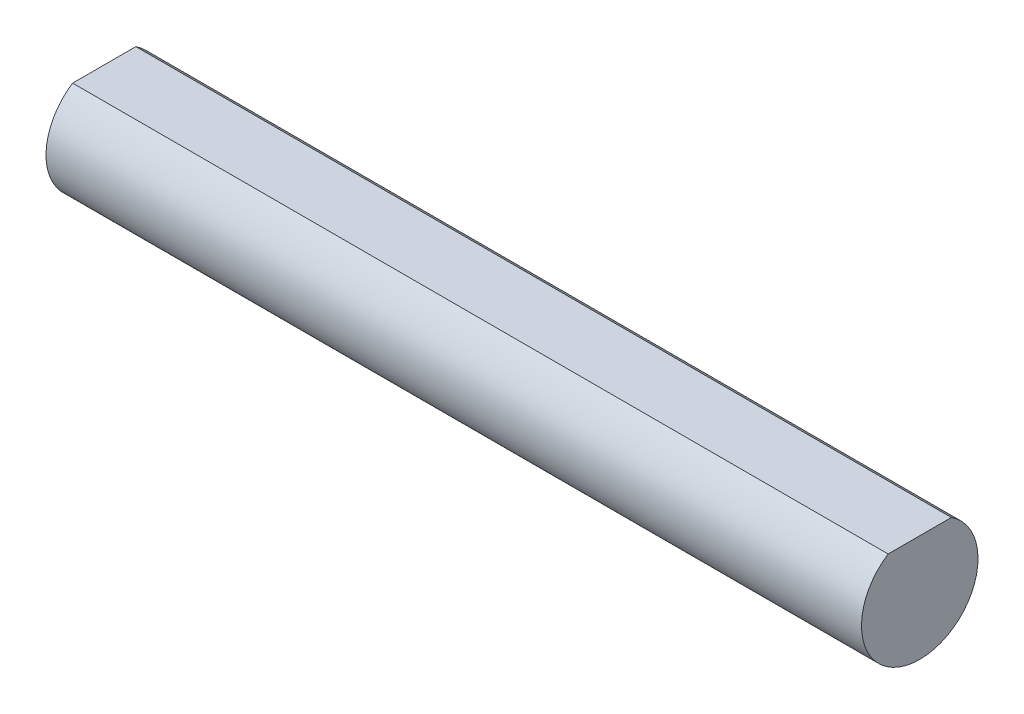
ISO-10303-21;
HEADER;
FILE_DESCRIPTION(('STEP AP214'),'2;1');
FILE_NAME('part.step','',(''),(''),'','','');
FILE_SCHEMA(('AUTOMOTIVE_DESIGN { 1 0 10303 214 1 1 1 1 }'));
ENDSEC;
DATA;
#1=APPLICATION_CONTEXT('core data for automotive mechanical design processes');
#2=APPLICATION_PROTOCOL_DEFINITION('international standard','automotive_design',2000,#1);
#3=PRODUCT_CONTEXT('',#1,'mechanical');
#4=PRODUCT('Part','Part','',(#3));
#5=PRODUCT_RELATED_PRODUCT_CATEGORY('part','',(#4));
#6=PRODUCT_DEFINITION_FORMATION('','',#4);
#7=PRODUCT_DEFINITION_CONTEXT('part definition',#1,'design');
#8=PRODUCT_DEFINITION('design','',#6,#7);
#9=PRODUCT_DEFINITION_SHAPE('','',#8);
#10=(LENGTH_UNIT() NAMED_UNIT(*) SI_UNIT(.MILLI.,.METRE.));
#11=(NAMED_UNIT(*) PLANE_ANGLE_UNIT() SI_UNIT($,.RADIAN.));
#12=(NAMED_UNIT(*) SI_UNIT($,.STERADIAN.) SOLID_ANGLE_UNIT());
#13=UNCERTAINTY_MEASURE_WITH_UNIT(LENGTH_MEASURE(1.E-05),#10,'distance_accuracy_value','');
#14=(GEOMETRIC_REPRESENTATION_CONTEXT(3) GLOBAL_UNCERTAINTY_ASSIGNED_CONTEXT((#13)) GLOBAL_UNIT_ASSIGNED_CONTEXT((#10,
#11,#12)) REPRESENTATION_CONTEXT('',''));
#15=CARTESIAN_POINT('',(0.,0.,0.));
#16=DIRECTION('',(0.,0.,1.));
#17=DIRECTION('',(1.,0.,0.));
#18=AXIS2_PLACEMENT_3D('',#15,#16,#17);
#19=CARTESIAN_POINT('',(35.,0.,0.));
#20=DIRECTION('',(-1.,0.,0.));
#21=DIRECTION('',(0.,0.,1.));
#22=AXIS2_PLACEMENT_3D('',#19,#20,#21);
#23=CYLINDRICAL_SURFACE('',#22,2.5);
#24=CARTESIAN_POINT('',(0.,0.,0.));
#25=DIRECTION('',(1.,0.,0.));
#26=DIRECTION('',(0.,0.,-1.));
#27=AXIS2_PLACEMENT_3D('',#24,#25,#26);
#28=CIRCLE('',#27,2.5);
#29=CARTESIAN_POINT('',(0.,2.1,1.35646599662505));
#30=VERTEX_POINT('',#29);
#31=CARTESIAN_POINT('',(0.,2.1,-1.35646599662505));
#32=VERTEX_POINT('',#31);
#33=EDGE_CURVE('E72',#30,#32,#28,.T.);
#34=ORIENTED_EDGE('',*,*,#33,.T.);
#35=DIRECTION('',(-1.,0.,0.));
#36=VECTOR('',#35,1.);
#37=CARTESIAN_POINT('',(35.,2.1,-1.35646599662505));
#38=LINE('',#37,#36);
#39=CARTESIAN_POINT('',(35.,2.1,-1.35646599662505));
#40=VERTEX_POINT('',#39);
#41=EDGE_CURVE('E11',#40,#32,#38,.T.);
#42=ORIENTED_EDGE('',*,*,#41,.F.);
#43=CARTESIAN_POINT('',(35.,0.,0.));
#44=DIRECTION('',(1.,0.,0.));
#45=DIRECTION('',(0.,0.,-1.));
#46=AXIS2_PLACEMENT_3D('',#43,#44,#45);
#47=CIRCLE('',#46,2.5);
#48=CARTESIAN_POINT('',(35.,2.1,1.35646599662505));
#49=VERTEX_POINT('',#48);
#50=EDGE_CURVE('E71',#49,#40,#47,.T.);
#51=ORIENTED_EDGE('',*,*,#50,.F.);
#52=DIRECTION('',(-1.,0.,0.));
#53=VECTOR('',#52,1.);
#54=CARTESIAN_POINT('',(35.,2.1,1.35646599662505));
#55=LINE('',#54,#53);
#56=EDGE_CURVE('E48',#49,#30,#55,.T.);
#57=ORIENTED_EDGE('',*,*,#56,.T.);
#58=EDGE_LOOP('',(#34,#42,#51,#57));
#59=FACE_BOUND('',#58,.T.);
#60=ADVANCED_FACE('F39',(#59),#23,.T.);
#61=CARTESIAN_POINT('',(35.,2.1,-1.35646599662505));
#62=DIRECTION('',(0.,-1.,0.));
#63=DIRECTION('',(0.,0.,-1.));
#64=AXIS2_PLACEMENT_3D('',#61,#62,#63);
#65=PLANE('',#64);
#66=DIRECTION('',(0.,0.,1.));
#67=VECTOR('',#66,1.);
#68=CARTESIAN_POINT('',(0.,2.1,-1.35646599662505));
#69=LINE('',#68,#67);
#70=EDGE_CURVE('E63',#32,#30,#69,.T.);
#71=ORIENTED_EDGE('',*,*,#70,.T.);
#72=ORIENTED_EDGE('',*,*,#56,.F.);
#73=DIRECTION('',(0.,0.,1.));
#74=VECTOR('',#73,1.);
#75=CARTESIAN_POINT('',(35.,2.1,-1.35646599662505));
#76=LINE('',#75,#74);
#77=EDGE_CURVE('E55',#40,#49,#76,.T.);
#78=ORIENTED_EDGE('',*,*,#77,.F.);
#79=ORIENTED_EDGE('',*,*,#41,.T.);
#80=EDGE_LOOP('',(#71,#72,#78,#79));
#81=FACE_BOUND('',#80,.T.);
#82=ADVANCED_FACE('F66',(#81),#65,.F.);
#83=CARTESIAN_POINT('',(35.,0.,0.));
#84=DIRECTION('',(1.,0.,0.));
#85=DIRECTION('',(0.,0.,-1.));
#86=AXIS2_PLACEMENT_3D('',#83,#84,#85);
#87=PLANE('',#86);
#88=ORIENTED_EDGE('',*,*,#50,.T.);
#89=ORIENTED_EDGE('',*,*,#77,.T.);
#90=EDGE_LOOP('',(#88,#89));
#91=FACE_BOUND('',#90,.T.);
#92=ADVANCED_FACE('F83',(#91),#87,.T.);
#93=CARTESIAN_POINT('',(0.,0.,0.));
#94=DIRECTION('',(1.,0.,0.));
#95=DIRECTION('',(0.,0.,-1.));
#96=AXIS2_PLACEMENT_3D('',#93,#94,#95);
#97=PLANE('',#96);
#98=ORIENTED_EDGE('',*,*,#33,.F.);
#99=ORIENTED_EDGE('',*,*,#70,.F.);
#100=EDGE_LOOP('',(#98,#99));
#101=FACE_BOUND('',#100,.T.);
#102=ADVANCED_FACE('F76',(#101),#97,.F.);
#103=CLOSED_SHELL('',(#60,#82,#92,#102));
#104=MANIFOLD_SOLID_BREP('B2',#103);
#105=ADVANCED_BREP_SHAPE_REPRESENTATION('',(#18,#104),#14);
#106=SHAPE_DEFINITION_REPRESENTATION(#9,#105);
ENDSEC;
END-ISO-10303-21;
